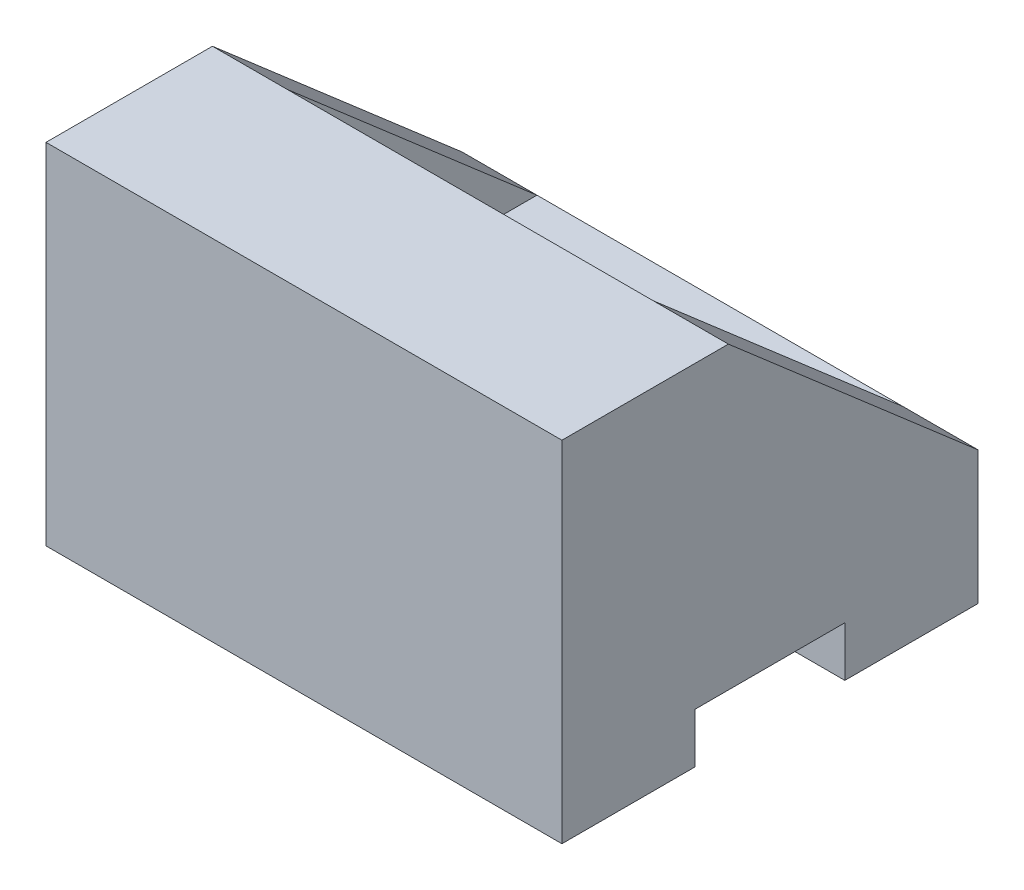
ISO-10303-21;
HEADER;
FILE_DESCRIPTION(('STEP AP214'),'2;1');
FILE_NAME('part.step','',(''),(''),'','','');
FILE_SCHEMA(('AUTOMOTIVE_DESIGN { 1 0 10303 214 1 1 1 1 }'));
ENDSEC;
DATA;
#1=APPLICATION_CONTEXT('core data for automotive mechanical design processes');
#2=APPLICATION_PROTOCOL_DEFINITION('international standard','automotive_design',2000,#1);
#3=PRODUCT_CONTEXT('',#1,'mechanical');
#4=PRODUCT('Part','Part','',(#3));
#5=PRODUCT_RELATED_PRODUCT_CATEGORY('part','',(#4));
#6=PRODUCT_DEFINITION_FORMATION('','',#4);
#7=PRODUCT_DEFINITION_CONTEXT('part definition',#1,'design');
#8=PRODUCT_DEFINITION('design','',#6,#7);
#9=PRODUCT_DEFINITION_SHAPE('','',#8);
#10=(LENGTH_UNIT() NAMED_UNIT(*) SI_UNIT(.MILLI.,.METRE.));
#11=(NAMED_UNIT(*) PLANE_ANGLE_UNIT() SI_UNIT($,.RADIAN.));
#12=(NAMED_UNIT(*) SI_UNIT($,.STERADIAN.) SOLID_ANGLE_UNIT());
#13=UNCERTAINTY_MEASURE_WITH_UNIT(LENGTH_MEASURE(1.E-05),#10,'distance_accuracy_value','');
#14=(GEOMETRIC_REPRESENTATION_CONTEXT(3) GLOBAL_UNCERTAINTY_ASSIGNED_CONTEXT((#13)) GLOBAL_UNIT_ASSIGNED_CONTEXT((#10,
#11,#12)) REPRESENTATION_CONTEXT('',''));
#15=CARTESIAN_POINT('',(0.,0.,0.));
#16=DIRECTION('',(0.,0.,1.));
#17=DIRECTION('',(1.,0.,0.));
#18=AXIS2_PLACEMENT_3D('',#15,#16,#17);
#19=CARTESIAN_POINT('',(31.,-5.93939393939394,0.));
#20=DIRECTION('',(0.,1.,0.));
#21=DIRECTION('',(0.,0.,1.));
#22=AXIS2_PLACEMENT_3D('',#19,#20,#21);
#23=PLANE('',#22);
#24=DIRECTION('',(0.,0.,-1.));
#25=VECTOR('',#24,1.);
#26=CARTESIAN_POINT('',(-22.,-5.93939393939394,0.));
#27=LINE('',#26,#25);
#28=CARTESIAN_POINT('',(-22.,-5.93939393939394,13.2031122031122));
#29=VERTEX_POINT('',#28);
#30=CARTESIAN_POINT('',(-22.,-5.93939393939394,-16.7968877968878));
#31=VERTEX_POINT('',#30);
#32=EDGE_CURVE('E146',#29,#31,#27,.T.);
#33=ORIENTED_EDGE('',*,*,#32,.F.);
#34=DIRECTION('',(-1.,0.,0.));
#35=VECTOR('',#34,1.);
#36=CARTESIAN_POINT('',(31.,-5.93939393939394,13.2031122031122));
#37=LINE('',#36,#35);
#38=CARTESIAN_POINT('',(22.,-5.93939393939394,13.2031122031122));
#39=VERTEX_POINT('',#38);
#40=EDGE_CURVE('E140',#39,#29,#37,.T.);
#41=ORIENTED_EDGE('',*,*,#40,.F.);
#42=DIRECTION('',(0.,0.,-1.));
#43=VECTOR('',#42,1.);
#44=CARTESIAN_POINT('',(22.,-5.93939393939394,0.));
#45=LINE('',#44,#43);
#46=CARTESIAN_POINT('',(22.,-5.93939393939394,-16.7968877968878));
#47=VERTEX_POINT('',#46);
#48=EDGE_CURVE('E173',#39,#47,#45,.T.);
#49=ORIENTED_EDGE('',*,*,#48,.T.);
#50=DIRECTION('',(-1.,0.,0.));
#51=VECTOR('',#50,1.);
#52=CARTESIAN_POINT('',(31.,-5.93939393939394,-16.7968877968878));
#53=LINE('',#52,#51);
#54=EDGE_CURVE('E145',#47,#31,#53,.T.);
#55=ORIENTED_EDGE('',*,*,#54,.T.);
#56=EDGE_LOOP('',(#33,#41,#49,#55));
#57=FACE_BOUND('',#56,.T.);
#58=ADVANCED_FACE('F50',(#57),#23,.T.);
#59=CARTESIAN_POINT('',(31.,0.,13.2031122031122));
#60=DIRECTION('',(0.,0.,-1.));
#61=DIRECTION('',(0.,1.,0.));
#62=AXIS2_PLACEMENT_3D('',#59,#60,#61);
#63=PLANE('',#62);
#64=DIRECTION('',(0.,-1.,0.));
#65=VECTOR('',#64,1.);
#66=CARTESIAN_POINT('',(-22.,0.,13.2031122031122));
#67=LINE('',#66,#65);
#68=CARTESIAN_POINT('',(-22.,20.0606060606061,13.2031122031122));
#69=VERTEX_POINT('',#68);
#70=EDGE_CURVE('E72',#69,#29,#67,.T.);
#71=ORIENTED_EDGE('',*,*,#70,.F.);
#72=DIRECTION('',(-1.,0.,0.));
#73=VECTOR('',#72,1.);
#74=CARTESIAN_POINT('',(31.,20.0606060606061,13.2031122031122));
#75=LINE('',#74,#73);
#76=CARTESIAN_POINT('',(22.,20.0606060606061,13.2031122031122));
#77=VERTEX_POINT('',#76);
#78=EDGE_CURVE('E248',#77,#69,#75,.T.);
#79=ORIENTED_EDGE('',*,*,#78,.F.);
#80=DIRECTION('',(0.,-1.,0.));
#81=VECTOR('',#80,1.);
#82=CARTESIAN_POINT('',(22.,0.,13.2031122031122));
#83=LINE('',#82,#81);
#84=EDGE_CURVE('E139',#77,#39,#83,.T.);
#85=ORIENTED_EDGE('',*,*,#84,.T.);
#86=ORIENTED_EDGE('',*,*,#40,.T.);
#87=EDGE_LOOP('',(#71,#79,#85,#86));
#88=FACE_BOUND('',#87,.T.);
#89=ADVANCED_FACE('F137',(#88),#63,.T.);
#90=CARTESIAN_POINT('',(31.,0.,33.2031122031122));
#91=DIRECTION('',(0.,0.,1.));
#92=DIRECTION('',(1.,0.,0.));
#93=AXIS2_PLACEMENT_3D('',#90,#91,#92);
#94=PLANE('',#93);
#95=DIRECTION('',(0.,1.,0.));
#96=VECTOR('',#95,1.);
#97=CARTESIAN_POINT('',(-31.,0.,33.2031122031122));
#98=LINE('',#97,#96);
#99=CARTESIAN_POINT('',(-31.,-21.9393939393939,33.2031122031122));
#100=VERTEX_POINT('',#99);
#101=CARTESIAN_POINT('',(-31.,20.0606060606061,33.2031122031122));
#102=VERTEX_POINT('',#101);
#103=EDGE_CURVE('E172',#100,#102,#98,.T.);
#104=ORIENTED_EDGE('',*,*,#103,.F.);
#105=DIRECTION('',(-1.,0.,0.));
#106=VECTOR('',#105,1.);
#107=CARTESIAN_POINT('',(31.,-21.9393939393939,33.2031122031122));
#108=LINE('',#107,#106);
#109=CARTESIAN_POINT('',(31.,-21.9393939393939,33.2031122031122));
#110=VERTEX_POINT('',#109);
#111=EDGE_CURVE('E11',#110,#100,#108,.T.);
#112=ORIENTED_EDGE('',*,*,#111,.F.);
#113=DIRECTION('',(0.,1.,0.));
#114=VECTOR('',#113,1.);
#115=CARTESIAN_POINT('',(31.,0.,33.2031122031122));
#116=LINE('',#115,#114);
#117=CARTESIAN_POINT('',(31.,20.0606060606061,33.2031122031122));
#118=VERTEX_POINT('',#117);
#119=EDGE_CURVE('E185',#110,#118,#116,.T.);
#120=ORIENTED_EDGE('',*,*,#119,.T.);
#121=DIRECTION('',(-1.,0.,0.));
#122=VECTOR('',#121,1.);
#123=CARTESIAN_POINT('',(31.,20.0606060606061,33.2031122031122));
#124=LINE('',#123,#122);
#125=EDGE_CURVE('E214',#118,#102,#124,.T.);
#126=ORIENTED_EDGE('',*,*,#125,.T.);
#127=EDGE_LOOP('',(#104,#112,#120,#126));
#128=FACE_BOUND('',#127,.T.);
#129=ADVANCED_FACE('F47',(#128),#94,.T.);
#130=CARTESIAN_POINT('',(31.,-21.9393939393939,0.));
#131=DIRECTION('',(0.,-1.,0.));
#132=DIRECTION('',(0.,0.,-1.));
#133=AXIS2_PLACEMENT_3D('',#130,#131,#132);
#134=PLANE('',#133);
#135=DIRECTION('',(0.,0.,1.));
#136=VECTOR('',#135,1.);
#137=CARTESIAN_POINT('',(-31.,-21.9393939393939,0.));
#138=LINE('',#137,#136);
#139=CARTESIAN_POINT('',(-31.,-21.9393939393939,17.2031122031122));
#140=VERTEX_POINT('',#139);
#141=EDGE_CURVE('E218',#140,#100,#138,.T.);
#142=ORIENTED_EDGE('',*,*,#141,.F.);
#143=DIRECTION('',(-1.,0.,0.));
#144=VECTOR('',#143,1.);
#145=CARTESIAN_POINT('',(31.,-21.9393939393939,17.2031122031122));
#146=LINE('',#145,#144);
#147=CARTESIAN_POINT('',(31.,-21.9393939393939,17.2031122031122));
#148=VERTEX_POINT('',#147);
#149=EDGE_CURVE('E57',#148,#140,#146,.T.);
#150=ORIENTED_EDGE('',*,*,#149,.F.);
#151=DIRECTION('',(0.,0.,1.));
#152=VECTOR('',#151,1.);
#153=CARTESIAN_POINT('',(31.,-21.9393939393939,0.));
#154=LINE('',#153,#152);
#155=EDGE_CURVE('E186',#148,#110,#154,.T.);
#156=ORIENTED_EDGE('',*,*,#155,.T.);
#157=ORIENTED_EDGE('',*,*,#111,.T.);
#158=EDGE_LOOP('',(#142,#150,#156,#157));
#159=FACE_BOUND('',#158,.T.);
#160=ADVANCED_FACE('F273',(#159),#134,.T.);
#161=CARTESIAN_POINT('',(31.,0.,17.2031122031122));
#162=DIRECTION('',(0.,0.,-1.));
#163=DIRECTION('',(0.,1.,0.));
#164=AXIS2_PLACEMENT_3D('',#161,#162,#163);
#165=PLANE('',#164);
#166=DIRECTION('',(0.,-1.,0.));
#167=VECTOR('',#166,1.);
#168=CARTESIAN_POINT('',(-31.,0.,17.2031122031122));
#169=LINE('',#168,#167);
#170=CARTESIAN_POINT('',(-31.,-15.9393939393939,17.2031122031122));
#171=VERTEX_POINT('',#170);
#172=EDGE_CURVE('E224',#171,#140,#169,.T.);
#173=ORIENTED_EDGE('',*,*,#172,.F.);
#174=DIRECTION('',(-1.,0.,0.));
#175=VECTOR('',#174,1.);
#176=CARTESIAN_POINT('',(31.,-15.9393939393939,17.2031122031122));
#177=LINE('',#176,#175);
#178=CARTESIAN_POINT('',(31.,-15.9393939393939,17.2031122031122));
#179=VERTEX_POINT('',#178);
#180=EDGE_CURVE('E262',#179,#171,#177,.T.);
#181=ORIENTED_EDGE('',*,*,#180,.F.);
#182=DIRECTION('',(0.,-1.,0.));
#183=VECTOR('',#182,1.);
#184=CARTESIAN_POINT('',(31.,0.,17.2031122031122));
#185=LINE('',#184,#183);
#186=EDGE_CURVE('E191',#179,#148,#185,.T.);
#187=ORIENTED_EDGE('',*,*,#186,.T.);
#188=ORIENTED_EDGE('',*,*,#149,.T.);
#189=EDGE_LOOP('',(#173,#181,#187,#188));
#190=FACE_BOUND('',#189,.T.);
#191=ADVANCED_FACE('F269',(#190),#165,.T.);
#192=CARTESIAN_POINT('',(31.,-15.9393939393939,0.));
#193=DIRECTION('',(0.,-1.,0.));
#194=DIRECTION('',(0.,0.,-1.));
#195=AXIS2_PLACEMENT_3D('',#192,#193,#194);
#196=PLANE('',#195);
#197=DIRECTION('',(0.,0.,1.));
#198=VECTOR('',#197,1.);
#199=CARTESIAN_POINT('',(-31.,-15.9393939393939,0.));
#200=LINE('',#199,#198);
#201=CARTESIAN_POINT('',(-31.,-15.9393939393939,-0.796887796887798));
#202=VERTEX_POINT('',#201);
#203=EDGE_CURVE('E230',#202,#171,#200,.T.);
#204=ORIENTED_EDGE('',*,*,#203,.F.);
#205=DIRECTION('',(-1.,0.,0.));
#206=VECTOR('',#205,1.);
#207=CARTESIAN_POINT('',(31.,-15.9393939393939,-0.796887796887798));
#208=LINE('',#207,#206);
#209=CARTESIAN_POINT('',(31.,-15.9393939393939,-0.796887796887798));
#210=VERTEX_POINT('',#209);
#211=EDGE_CURVE('E261',#210,#202,#208,.T.);
#212=ORIENTED_EDGE('',*,*,#211,.F.);
#213=DIRECTION('',(0.,0.,1.));
#214=VECTOR('',#213,1.);
#215=CARTESIAN_POINT('',(31.,-15.9393939393939,0.));
#216=LINE('',#215,#214);
#217=EDGE_CURVE('E194',#210,#179,#216,.T.);
#218=ORIENTED_EDGE('',*,*,#217,.T.);
#219=ORIENTED_EDGE('',*,*,#180,.T.);
#220=EDGE_LOOP('',(#204,#212,#218,#219));
#221=FACE_BOUND('',#220,.T.);
#222=ADVANCED_FACE('F285',(#221),#196,.T.);
#223=CARTESIAN_POINT('',(31.,0.,-0.796887796887798));
#224=DIRECTION('',(0.,0.,1.));
#225=DIRECTION('',(1.,0.,0.));
#226=AXIS2_PLACEMENT_3D('',#223,#224,#225);
#227=PLANE('',#226);
#228=DIRECTION('',(0.,1.,0.));
#229=VECTOR('',#228,1.);
#230=CARTESIAN_POINT('',(-31.,0.,-0.796887796887798));
#231=LINE('',#230,#229);
#232=CARTESIAN_POINT('',(-31.,-21.9393939393939,-0.796887796887798));
#233=VERTEX_POINT('',#232);
#234=EDGE_CURVE('E231',#233,#202,#231,.T.);
#235=ORIENTED_EDGE('',*,*,#234,.F.);
#236=DIRECTION('',(-1.,0.,0.));
#237=VECTOR('',#236,1.);
#238=CARTESIAN_POINT('',(31.,-21.9393939393939,-0.796887796887798));
#239=LINE('',#238,#237);
#240=CARTESIAN_POINT('',(31.,-21.9393939393939,-0.796887796887798));
#241=VERTEX_POINT('',#240);
#242=EDGE_CURVE('E256',#241,#233,#239,.T.);
#243=ORIENTED_EDGE('',*,*,#242,.F.);
#244=DIRECTION('',(0.,1.,0.));
#245=VECTOR('',#244,1.);
#246=CARTESIAN_POINT('',(31.,0.,-0.796887796887798));
#247=LINE('',#246,#245);
#248=EDGE_CURVE('E200',#241,#210,#247,.T.);
#249=ORIENTED_EDGE('',*,*,#248,.T.);
#250=ORIENTED_EDGE('',*,*,#211,.T.);
#251=EDGE_LOOP('',(#235,#243,#249,#250));
#252=FACE_BOUND('',#251,.T.);
#253=ADVANCED_FACE('F306',(#252),#227,.T.);
#254=CARTESIAN_POINT('',(31.,-21.9393939393939,0.));
#255=DIRECTION('',(0.,-1.,0.));
#256=DIRECTION('',(0.,0.,-1.));
#257=AXIS2_PLACEMENT_3D('',#254,#255,#256);
#258=PLANE('',#257);
#259=DIRECTION('',(0.,0.,1.));
#260=VECTOR('',#259,1.);
#261=CARTESIAN_POINT('',(-31.,-21.9393939393939,0.));
#262=LINE('',#261,#260);
#263=CARTESIAN_POINT('',(-31.,-21.9393939393939,-16.7968877968878));
#264=VERTEX_POINT('',#263);
#265=EDGE_CURVE('E234',#264,#233,#262,.T.);
#266=ORIENTED_EDGE('',*,*,#265,.F.);
#267=DIRECTION('',(-1.,0.,0.));
#268=VECTOR('',#267,1.);
#269=CARTESIAN_POINT('',(31.,-21.9393939393939,-16.7968877968878));
#270=LINE('',#269,#268);
#271=CARTESIAN_POINT('',(31.,-21.9393939393939,-16.7968877968878));
#272=VERTEX_POINT('',#271);
#273=EDGE_CURVE('E254',#272,#264,#270,.T.);
#274=ORIENTED_EDGE('',*,*,#273,.F.);
#275=DIRECTION('',(0.,0.,1.));
#276=VECTOR('',#275,1.);
#277=CARTESIAN_POINT('',(31.,-21.9393939393939,0.));
#278=LINE('',#277,#276);
#279=EDGE_CURVE('E201',#272,#241,#278,.T.);
#280=ORIENTED_EDGE('',*,*,#279,.T.);
#281=ORIENTED_EDGE('',*,*,#242,.T.);
#282=EDGE_LOOP('',(#266,#274,#280,#281));
#283=FACE_BOUND('',#282,.T.);
#284=ADVANCED_FACE('F308',(#283),#258,.T.);
#285=CARTESIAN_POINT('',(31.,0.,-16.7968877968878));
#286=DIRECTION('',(0.,0.,-1.));
#287=DIRECTION('',(0.,1.,0.));
#288=AXIS2_PLACEMENT_3D('',#285,#286,#287);
#289=PLANE('',#288);
#290=DIRECTION('',(0.,-1.,0.));
#291=VECTOR('',#290,1.);
#292=CARTESIAN_POINT('',(-31.,0.,-16.7968877968878));
#293=LINE('',#292,#291);
#294=CARTESIAN_POINT('',(-31.,-5.93939393939394,-16.7968877968878));
#295=VERTEX_POINT('',#294);
#296=EDGE_CURVE('E239',#295,#264,#293,.T.);
#297=ORIENTED_EDGE('',*,*,#296,.F.);
#298=DIRECTION('',(1.,0.,0.));
#299=VECTOR('',#298,1.);
#300=CARTESIAN_POINT('',(-31.,-5.93939393939394,-16.7968877968878));
#301=LINE('',#300,#299);
#302=EDGE_CURVE('E62',#295,#31,#301,.T.);
#303=ORIENTED_EDGE('',*,*,#302,.T.);
#304=ORIENTED_EDGE('',*,*,#54,.F.);
#305=CARTESIAN_POINT('',(31.,-5.93939393939394,-16.7968877968878));
#306=VERTEX_POINT('',#305);
#307=EDGE_CURVE('E252',#306,#47,#53,.T.);
#308=ORIENTED_EDGE('',*,*,#307,.F.);
#309=DIRECTION('',(0.,-1.,0.));
#310=VECTOR('',#309,1.);
#311=CARTESIAN_POINT('',(31.,0.,-16.7968877968878));
#312=LINE('',#311,#310);
#313=EDGE_CURVE('E210',#306,#272,#312,.T.);
#314=ORIENTED_EDGE('',*,*,#313,.T.);
#315=ORIENTED_EDGE('',*,*,#273,.T.);
#316=EDGE_LOOP('',(#297,#303,#304,#308,#314,#315));
#317=FACE_BOUND('',#316,.T.);
#318=ADVANCED_FACE('F305',(#317),#289,.T.);
#319=CARTESIAN_POINT('',(31.,20.0606060606061,0.));
#320=DIRECTION('',(0.,1.,0.));
#321=DIRECTION('',(0.,0.,1.));
#322=AXIS2_PLACEMENT_3D('',#319,#320,#321);
#323=PLANE('',#322);
#324=DIRECTION('',(0.,0.,-1.));
#325=VECTOR('',#324,1.);
#326=CARTESIAN_POINT('',(-31.,20.0606060606061,0.));
#327=LINE('',#326,#325);
#328=CARTESIAN_POINT('',(-31.,20.0606060606061,13.2031122031122));
#329=VERTEX_POINT('',#328);
#330=EDGE_CURVE('E190',#102,#329,#327,.T.);
#331=ORIENTED_EDGE('',*,*,#330,.F.);
#332=ORIENTED_EDGE('',*,*,#125,.F.);
#333=DIRECTION('',(0.,0.,-1.));
#334=VECTOR('',#333,1.);
#335=CARTESIAN_POINT('',(31.,20.0606060606061,0.));
#336=LINE('',#335,#334);
#337=CARTESIAN_POINT('',(31.,20.0606060606061,13.2031122031122));
#338=VERTEX_POINT('',#337);
#339=EDGE_CURVE('E211',#118,#338,#336,.T.);
#340=ORIENTED_EDGE('',*,*,#339,.T.);
#341=EDGE_CURVE('E144',#338,#77,#75,.T.);
#342=ORIENTED_EDGE('',*,*,#341,.T.);
#343=ORIENTED_EDGE('',*,*,#78,.T.);
#344=DIRECTION('',(1.,0.,0.));
#345=VECTOR('',#344,1.);
#346=CARTESIAN_POINT('',(-31.,20.0606060606061,13.2031122031122));
#347=LINE('',#346,#345);
#348=EDGE_CURVE('E167',#329,#69,#347,.T.);
#349=ORIENTED_EDGE('',*,*,#348,.F.);
#350=EDGE_LOOP('',(#331,#332,#340,#342,#343,#349));
#351=FACE_BOUND('',#350,.T.);
#352=ADVANCED_FACE('F293',(#351),#323,.T.);
#353=CARTESIAN_POINT('',(31.,0.,0.));
#354=DIRECTION('',(1.,0.,0.));
#355=DIRECTION('',(0.,0.,-1.));
#356=AXIS2_PLACEMENT_3D('',#353,#354,#355);
#357=PLANE('',#356);
#358=ORIENTED_EDGE('',*,*,#313,.F.);
#359=DIRECTION('',(0.,-0.654930538417842,-0.755689082789818));
#360=VECTOR('',#359,1.);
#361=CARTESIAN_POINT('',(31.,4.92139462951646,-4.26520867891426));
#362=LINE('',#361,#360);
#363=EDGE_CURVE('E168',#338,#306,#362,.T.);
#364=ORIENTED_EDGE('',*,*,#363,.F.);
#365=ORIENTED_EDGE('',*,*,#339,.F.);
#366=ORIENTED_EDGE('',*,*,#119,.F.);
#367=ORIENTED_EDGE('',*,*,#155,.F.);
#368=ORIENTED_EDGE('',*,*,#186,.F.);
#369=ORIENTED_EDGE('',*,*,#217,.F.);
#370=ORIENTED_EDGE('',*,*,#248,.F.);
#371=ORIENTED_EDGE('',*,*,#279,.F.);
#372=EDGE_LOOP('',(#358,#364,#365,#366,#367,#368,#369,#370,#371));
#373=FACE_BOUND('',#372,.T.);
#374=ADVANCED_FACE('F286',(#373),#357,.T.);
#375=CARTESIAN_POINT('',(-31.,0.,0.));
#376=DIRECTION('',(1.,0.,0.));
#377=DIRECTION('',(0.,0.,-1.));
#378=AXIS2_PLACEMENT_3D('',#375,#376,#377);
#379=PLANE('',#378);
#380=DIRECTION('',(0.,-0.654930538417842,-0.755689082789818));
#381=VECTOR('',#380,1.);
#382=CARTESIAN_POINT('',(-31.,4.92139462951646,-4.26520867891426));
#383=LINE('',#382,#381);
#384=EDGE_CURVE('E153',#329,#295,#383,.T.);
#385=ORIENTED_EDGE('',*,*,#384,.T.);
#386=ORIENTED_EDGE('',*,*,#296,.T.);
#387=ORIENTED_EDGE('',*,*,#265,.T.);
#388=ORIENTED_EDGE('',*,*,#234,.T.);
#389=ORIENTED_EDGE('',*,*,#203,.T.);
#390=ORIENTED_EDGE('',*,*,#172,.T.);
#391=ORIENTED_EDGE('',*,*,#141,.T.);
#392=ORIENTED_EDGE('',*,*,#103,.T.);
#393=ORIENTED_EDGE('',*,*,#330,.T.);
#394=EDGE_LOOP('',(#385,#386,#387,#388,#389,#390,#391,#392,#393));
#395=FACE_BOUND('',#394,.T.);
#396=ADVANCED_FACE('F279',(#395),#379,.F.);
#397=CARTESIAN_POINT('',(31.,4.92139462951646,-4.26520867891426));
#398=DIRECTION('',(0.,0.755689082789818,-0.654930538417842));
#399=DIRECTION('',(0.,0.654930538417842,0.755689082789818));
#400=AXIS2_PLACEMENT_3D('',#397,#398,#399);
#401=PLANE('',#400);
#402=DIRECTION('',(0.,-0.654930538417842,-0.755689082789818));
#403=VECTOR('',#402,1.);
#404=CARTESIAN_POINT('',(22.,4.92139462951646,-4.26520867891426));
#405=LINE('',#404,#403);
#406=EDGE_CURVE('E164',#77,#47,#405,.T.);
#407=ORIENTED_EDGE('',*,*,#406,.F.);
#408=ORIENTED_EDGE('',*,*,#341,.F.);
#409=ORIENTED_EDGE('',*,*,#363,.T.);
#410=ORIENTED_EDGE('',*,*,#307,.T.);
#411=EDGE_LOOP('',(#407,#408,#409,#410));
#412=FACE_BOUND('',#411,.T.);
#413=ADVANCED_FACE('F313',(#412),#401,.T.);
#414=CARTESIAN_POINT('',(22.,0.,0.));
#415=DIRECTION('',(1.,0.,0.));
#416=DIRECTION('',(0.,0.,-1.));
#417=AXIS2_PLACEMENT_3D('',#414,#415,#416);
#418=PLANE('',#417);
#419=ORIENTED_EDGE('',*,*,#406,.T.);
#420=ORIENTED_EDGE('',*,*,#48,.F.);
#421=ORIENTED_EDGE('',*,*,#84,.F.);
#422=EDGE_LOOP('',(#419,#420,#421));
#423=FACE_BOUND('',#422,.T.);
#424=ADVANCED_FACE('F311',(#423),#418,.F.);
#425=CARTESIAN_POINT('',(-31.,4.92139462951646,-4.26520867891426));
#426=DIRECTION('',(0.,-0.755689082789818,0.654930538417842));
#427=DIRECTION('',(0.,-0.654930538417842,-0.755689082789818));
#428=AXIS2_PLACEMENT_3D('',#425,#426,#427);
#429=PLANE('',#428);
#430=DIRECTION('',(0.,-0.654930538417842,-0.755689082789818));
#431=VECTOR('',#430,1.);
#432=CARTESIAN_POINT('',(-22.,4.92139462951646,-4.26520867891426));
#433=LINE('',#432,#431);
#434=EDGE_CURVE('E156',#69,#31,#433,.T.);
#435=ORIENTED_EDGE('',*,*,#434,.T.);
#436=ORIENTED_EDGE('',*,*,#302,.F.);
#437=ORIENTED_EDGE('',*,*,#384,.F.);
#438=ORIENTED_EDGE('',*,*,#348,.T.);
#439=EDGE_LOOP('',(#435,#436,#437,#438));
#440=FACE_BOUND('',#439,.T.);
#441=ADVANCED_FACE('F300',(#440),#429,.F.);
#442=CARTESIAN_POINT('',(-22.,0.,0.));
#443=DIRECTION('',(1.,0.,0.));
#444=DIRECTION('',(0.,0.,-1.));
#445=AXIS2_PLACEMENT_3D('',#442,#443,#444);
#446=PLANE('',#445);
#447=ORIENTED_EDGE('',*,*,#434,.F.);
#448=ORIENTED_EDGE('',*,*,#70,.T.);
#449=ORIENTED_EDGE('',*,*,#32,.T.);
#450=EDGE_LOOP('',(#447,#448,#449));
#451=FACE_BOUND('',#450,.T.);
#452=ADVANCED_FACE('F154',(#451),#446,.T.);
#453=CLOSED_SHELL('',(#58,#89,#129,#160,#191,#222,#253,#284,#318,#352,#374,#396,#413,#424,#441,#452));
#454=MANIFOLD_SOLID_BREP('B2',#453);
#455=ADVANCED_BREP_SHAPE_REPRESENTATION('',(#18,#454),#14);
#456=SHAPE_DEFINITION_REPRESENTATION(#9,#455);
ENDSEC;
END-ISO-10303-21;
